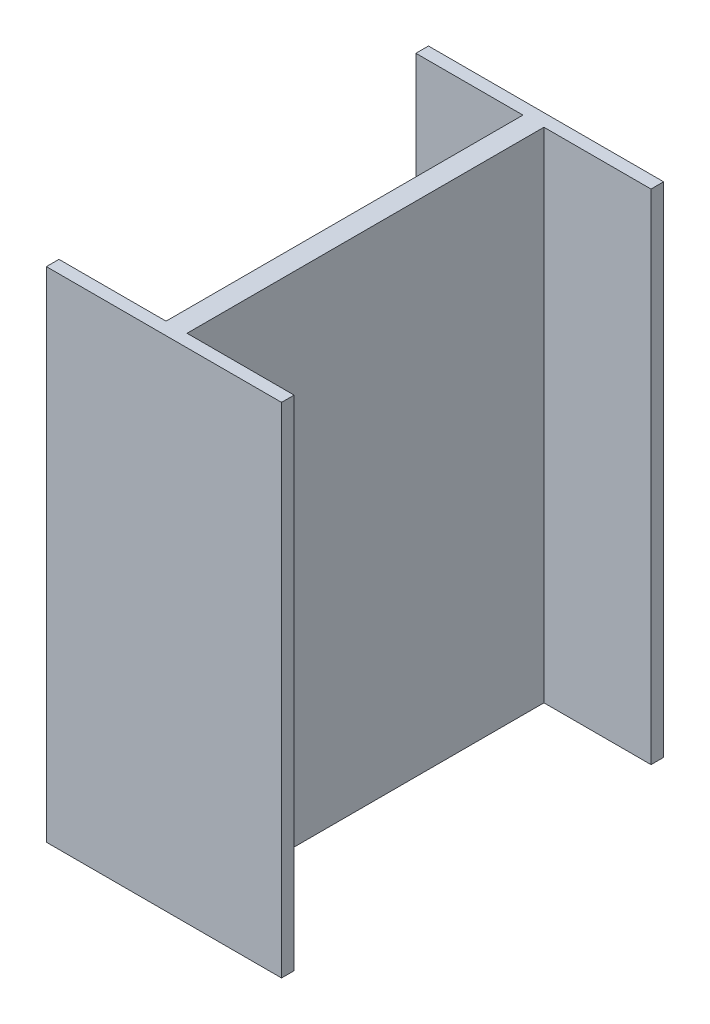
ISO-10303-21;
HEADER;
FILE_DESCRIPTION(('STEP AP214'),'2;1');
FILE_NAME('part.step','',(''),(''),'','','');
FILE_SCHEMA(('AUTOMOTIVE_DESIGN { 1 0 10303 214 1 1 1 1 }'));
ENDSEC;
DATA;
#1=APPLICATION_CONTEXT('core data for automotive mechanical design processes');
#2=APPLICATION_PROTOCOL_DEFINITION('international standard','automotive_design',2000,#1);
#3=PRODUCT_CONTEXT('',#1,'mechanical');
#4=PRODUCT('Part','Part','',(#3));
#5=PRODUCT_RELATED_PRODUCT_CATEGORY('part','',(#4));
#6=PRODUCT_DEFINITION_FORMATION('','',#4);
#7=PRODUCT_DEFINITION_CONTEXT('part definition',#1,'design');
#8=PRODUCT_DEFINITION('design','',#6,#7);
#9=PRODUCT_DEFINITION_SHAPE('','',#8);
#10=(LENGTH_UNIT() NAMED_UNIT(*) SI_UNIT(.MILLI.,.METRE.));
#11=(NAMED_UNIT(*) PLANE_ANGLE_UNIT() SI_UNIT($,.RADIAN.));
#12=(NAMED_UNIT(*) SI_UNIT($,.STERADIAN.) SOLID_ANGLE_UNIT());
#13=UNCERTAINTY_MEASURE_WITH_UNIT(LENGTH_MEASURE(1.E-05),#10,'distance_accuracy_value','');
#14=(GEOMETRIC_REPRESENTATION_CONTEXT(3) GLOBAL_UNCERTAINTY_ASSIGNED_CONTEXT((#13)) GLOBAL_UNIT_ASSIGNED_CONTEXT((#10,
#11,#12)) REPRESENTATION_CONTEXT('',''));
#15=CARTESIAN_POINT('',(0.,0.,0.));
#16=DIRECTION('',(0.,0.,1.));
#17=DIRECTION('',(1.,0.,0.));
#18=AXIS2_PLACEMENT_3D('',#15,#16,#17);
#19=CARTESIAN_POINT('',(-25.0000000000001,1187.25,-425.));
#20=DIRECTION('',(0.,0.,1.));
#21=DIRECTION('',(1.,0.,0.));
#22=AXIS2_PLACEMENT_3D('',#19,#20,#21);
#23=PLANE('',#22);
#24=DIRECTION('',(-1.,0.,0.));
#25=VECTOR('',#24,1.);
#26=CARTESIAN_POINT('',(-25.0000000000001,0.,-425.));
#27=LINE('',#26,#25);
#28=CARTESIAN_POINT('',(-25.0000000000001,0.,-425.));
#29=VERTEX_POINT('',#28);
#30=CARTESIAN_POINT('',(-280.014880556969,0.,-425.));
#31=VERTEX_POINT('',#30);
#32=EDGE_CURVE('E163',#29,#31,#27,.T.);
#33=ORIENTED_EDGE('',*,*,#32,.F.);
#34=DIRECTION('',(0.,-1.,0.));
#35=VECTOR('',#34,1.);
#36=CARTESIAN_POINT('',(-25.0000000000001,1187.25,-425.));
#37=LINE('',#36,#35);
#38=CARTESIAN_POINT('',(-25.0000000000001,1187.25,-425.));
#39=VERTEX_POINT('',#38);
#40=EDGE_CURVE('E11',#39,#29,#37,.T.);
#41=ORIENTED_EDGE('',*,*,#40,.F.);
#42=DIRECTION('',(-1.,0.,0.));
#43=VECTOR('',#42,1.);
#44=CARTESIAN_POINT('',(-25.0000000000001,1187.25,-425.));
#45=LINE('',#44,#43);
#46=CARTESIAN_POINT('',(-280.014880556969,1187.25,-425.));
#47=VERTEX_POINT('',#46);
#48=EDGE_CURVE('E193',#39,#47,#45,.T.);
#49=ORIENTED_EDGE('',*,*,#48,.T.);
#50=DIRECTION('',(0.,-1.,0.));
#51=VECTOR('',#50,1.);
#52=CARTESIAN_POINT('',(-280.014880556969,1187.25,-425.));
#53=LINE('',#52,#51);
#54=EDGE_CURVE('E45',#47,#31,#53,.T.);
#55=ORIENTED_EDGE('',*,*,#54,.T.);
#56=EDGE_LOOP('',(#33,#41,#49,#55));
#57=FACE_BOUND('',#56,.T.);
#58=ADVANCED_FACE('F42',(#57),#23,.T.);
#59=CARTESIAN_POINT('',(-25.0000000000001,1187.25,-425.));
#60=DIRECTION('',(1.,0.,0.));
#61=DIRECTION('',(0.,0.,-1.));
#62=AXIS2_PLACEMENT_3D('',#59,#60,#61);
#63=PLANE('',#62);
#64=DIRECTION('',(0.,0.,1.));
#65=VECTOR('',#64,1.);
#66=CARTESIAN_POINT('',(-25.0000000000001,0.,-425.));
#67=LINE('',#66,#65);
#68=CARTESIAN_POINT('',(-25.0000000000001,0.,425.));
#69=VERTEX_POINT('',#68);
#70=EDGE_CURVE('E99',#29,#69,#67,.T.);
#71=ORIENTED_EDGE('',*,*,#70,.T.);
#72=DIRECTION('',(0.,-1.,0.));
#73=VECTOR('',#72,1.);
#74=CARTESIAN_POINT('',(-25.0000000000001,1187.25,425.));
#75=LINE('',#74,#73);
#76=CARTESIAN_POINT('',(-25.0000000000001,1187.25,425.));
#77=VERTEX_POINT('',#76);
#78=EDGE_CURVE('E51',#77,#69,#75,.T.);
#79=ORIENTED_EDGE('',*,*,#78,.F.);
#80=DIRECTION('',(0.,0.,1.));
#81=VECTOR('',#80,1.);
#82=CARTESIAN_POINT('',(-25.0000000000001,1187.25,-425.));
#83=LINE('',#82,#81);
#84=EDGE_CURVE('E141',#39,#77,#83,.T.);
#85=ORIENTED_EDGE('',*,*,#84,.F.);
#86=ORIENTED_EDGE('',*,*,#40,.T.);
#87=EDGE_LOOP('',(#71,#79,#85,#86));
#88=FACE_BOUND('',#87,.T.);
#89=ADVANCED_FACE('F269',(#88),#63,.F.);
#90=CARTESIAN_POINT('',(-25.0000000000001,1187.25,425.));
#91=DIRECTION('',(0.,0.,1.));
#92=DIRECTION('',(1.,0.,0.));
#93=AXIS2_PLACEMENT_3D('',#90,#91,#92);
#94=PLANE('',#93);
#95=DIRECTION('',(-1.,0.,0.));
#96=VECTOR('',#95,1.);
#97=CARTESIAN_POINT('',(-25.0000000000001,0.,425.));
#98=LINE('',#97,#96);
#99=CARTESIAN_POINT('',(-280.014880556968,0.,425.));
#100=VERTEX_POINT('',#99);
#101=EDGE_CURVE('E148',#69,#100,#98,.T.);
#102=ORIENTED_EDGE('',*,*,#101,.T.);
#103=DIRECTION('',(0.,-1.,0.));
#104=VECTOR('',#103,1.);
#105=CARTESIAN_POINT('',(-280.014880556968,1187.25,425.));
#106=LINE('',#105,#104);
#107=CARTESIAN_POINT('',(-280.014880556968,1187.25,425.));
#108=VERTEX_POINT('',#107);
#109=EDGE_CURVE('E145',#108,#100,#106,.T.);
#110=ORIENTED_EDGE('',*,*,#109,.F.);
#111=DIRECTION('',(-1.,0.,0.));
#112=VECTOR('',#111,1.);
#113=CARTESIAN_POINT('',(-25.0000000000001,1187.25,425.));
#114=LINE('',#113,#112);
#115=EDGE_CURVE('E136',#77,#108,#114,.T.);
#116=ORIENTED_EDGE('',*,*,#115,.F.);
#117=ORIENTED_EDGE('',*,*,#78,.T.);
#118=EDGE_LOOP('',(#102,#110,#116,#117));
#119=FACE_BOUND('',#118,.T.);
#120=ADVANCED_FACE('F146',(#119),#94,.F.);
#121=CARTESIAN_POINT('',(-280.014880556966,1187.25,455.));
#122=DIRECTION('',(-1.,0.,0.));
#123=DIRECTION('',(0.,0.,1.));
#124=AXIS2_PLACEMENT_3D('',#121,#122,#123);
#125=PLANE('',#124);
#126=DIRECTION('',(0.,0.,-1.));
#127=VECTOR('',#126,1.);
#128=CARTESIAN_POINT('',(-280.014880556966,0.,455.));
#129=LINE('',#128,#127);
#130=CARTESIAN_POINT('',(-280.014880556966,0.,455.));
#131=VERTEX_POINT('',#130);
#132=EDGE_CURVE('E190',#131,#100,#129,.T.);
#133=ORIENTED_EDGE('',*,*,#132,.F.);
#134=DIRECTION('',(0.,-1.,0.));
#135=VECTOR('',#134,1.);
#136=CARTESIAN_POINT('',(-280.014880556966,1187.25,455.));
#137=LINE('',#136,#135);
#138=CARTESIAN_POINT('',(-280.014880556966,1187.25,455.));
#139=VERTEX_POINT('',#138);
#140=EDGE_CURVE('E152',#139,#131,#137,.T.);
#141=ORIENTED_EDGE('',*,*,#140,.F.);
#142=DIRECTION('',(0.,0.,-1.));
#143=VECTOR('',#142,1.);
#144=CARTESIAN_POINT('',(-280.014880556966,1187.25,455.));
#145=LINE('',#144,#143);
#146=EDGE_CURVE('E140',#139,#108,#145,.T.);
#147=ORIENTED_EDGE('',*,*,#146,.T.);
#148=ORIENTED_EDGE('',*,*,#109,.T.);
#149=EDGE_LOOP('',(#133,#141,#147,#148));
#150=FACE_BOUND('',#149,.T.);
#151=ADVANCED_FACE('F155',(#150),#125,.T.);
#152=CARTESIAN_POINT('',(-37.5,1187.25,455.));
#153=DIRECTION('',(0.,0.,1.));
#154=DIRECTION('',(1.,0.,0.));
#155=AXIS2_PLACEMENT_3D('',#152,#153,#154);
#156=PLANE('',#155);
#157=DIRECTION('',(-1.,0.,0.));
#158=VECTOR('',#157,1.);
#159=CARTESIAN_POINT('',(-37.5,0.,455.));
#160=LINE('',#159,#158);
#161=CARTESIAN_POINT('',(280.014880556966,0.,455.));
#162=VERTEX_POINT('',#161);
#163=EDGE_CURVE('E187',#162,#131,#160,.T.);
#164=ORIENTED_EDGE('',*,*,#163,.F.);
#165=DIRECTION('',(0.,-1.,0.));
#166=VECTOR('',#165,1.);
#167=CARTESIAN_POINT('',(280.014880556966,1187.25,455.));
#168=LINE('',#167,#166);
#169=CARTESIAN_POINT('',(280.014880556966,1187.25,455.));
#170=VERTEX_POINT('',#169);
#171=EDGE_CURVE('E197',#170,#162,#168,.T.);
#172=ORIENTED_EDGE('',*,*,#171,.F.);
#173=DIRECTION('',(1.,0.,0.));
#174=VECTOR('',#173,1.);
#175=CARTESIAN_POINT('',(37.5,1187.25,455.));
#176=LINE('',#175,#174);
#177=EDGE_CURVE('E156',#139,#170,#176,.T.);
#178=ORIENTED_EDGE('',*,*,#177,.F.);
#179=ORIENTED_EDGE('',*,*,#140,.T.);
#180=EDGE_LOOP('',(#164,#172,#178,#179));
#181=FACE_BOUND('',#180,.T.);
#182=ADVANCED_FACE('F220',(#181),#156,.T.);
#183=CARTESIAN_POINT('',(280.014880556966,1187.25,455.));
#184=DIRECTION('',(-1.,0.,0.));
#185=DIRECTION('',(0.,0.,1.));
#186=AXIS2_PLACEMENT_3D('',#183,#184,#185);
#187=PLANE('',#186);
#188=DIRECTION('',(0.,0.,-1.));
#189=VECTOR('',#188,1.);
#190=CARTESIAN_POINT('',(280.014880556966,0.,455.));
#191=LINE('',#190,#189);
#192=CARTESIAN_POINT('',(280.014880556968,0.,425.));
#193=VERTEX_POINT('',#192);
#194=EDGE_CURVE('E184',#162,#193,#191,.T.);
#195=ORIENTED_EDGE('',*,*,#194,.T.);
#196=DIRECTION('',(0.,-1.,0.));
#197=VECTOR('',#196,1.);
#198=CARTESIAN_POINT('',(280.014880556968,1187.25,425.));
#199=LINE('',#198,#197);
#200=CARTESIAN_POINT('',(280.014880556968,1187.25,425.));
#201=VERTEX_POINT('',#200);
#202=EDGE_CURVE('E200',#201,#193,#199,.T.);
#203=ORIENTED_EDGE('',*,*,#202,.F.);
#204=DIRECTION('',(0.,0.,-1.));
#205=VECTOR('',#204,1.);
#206=CARTESIAN_POINT('',(280.014880556966,1187.25,455.));
#207=LINE('',#206,#205);
#208=EDGE_CURVE('E158',#170,#201,#207,.T.);
#209=ORIENTED_EDGE('',*,*,#208,.F.);
#210=ORIENTED_EDGE('',*,*,#171,.T.);
#211=EDGE_LOOP('',(#195,#203,#209,#210));
#212=FACE_BOUND('',#211,.T.);
#213=ADVANCED_FACE('F223',(#212),#187,.F.);
#214=CARTESIAN_POINT('',(25.0000000000001,1187.25,425.));
#215=DIRECTION('',(0.,0.,-1.));
#216=DIRECTION('',(-1.,0.,0.));
#217=AXIS2_PLACEMENT_3D('',#214,#215,#216);
#218=PLANE('',#217);
#219=DIRECTION('',(1.,0.,0.));
#220=VECTOR('',#219,1.);
#221=CARTESIAN_POINT('',(25.0000000000001,0.,425.));
#222=LINE('',#221,#220);
#223=CARTESIAN_POINT('',(25.0000000000001,0.,425.));
#224=VERTEX_POINT('',#223);
#225=EDGE_CURVE('E181',#224,#193,#222,.T.);
#226=ORIENTED_EDGE('',*,*,#225,.F.);
#227=DIRECTION('',(0.,-1.,0.));
#228=VECTOR('',#227,1.);
#229=CARTESIAN_POINT('',(25.0000000000001,1187.25,425.));
#230=LINE('',#229,#228);
#231=CARTESIAN_POINT('',(25.0000000000001,1187.25,425.));
#232=VERTEX_POINT('',#231);
#233=EDGE_CURVE('E202',#232,#224,#230,.T.);
#234=ORIENTED_EDGE('',*,*,#233,.F.);
#235=DIRECTION('',(1.,0.,0.));
#236=VECTOR('',#235,1.);
#237=CARTESIAN_POINT('',(25.0000000000001,1187.25,425.));
#238=LINE('',#237,#236);
#239=EDGE_CURVE('E227',#232,#201,#238,.T.);
#240=ORIENTED_EDGE('',*,*,#239,.T.);
#241=ORIENTED_EDGE('',*,*,#202,.T.);
#242=EDGE_LOOP('',(#226,#234,#240,#241));
#243=FACE_BOUND('',#242,.T.);
#244=ADVANCED_FACE('F259',(#243),#218,.T.);
#245=CARTESIAN_POINT('',(25.0000000000001,1187.25,-425.));
#246=DIRECTION('',(1.,0.,0.));
#247=DIRECTION('',(0.,0.,-1.));
#248=AXIS2_PLACEMENT_3D('',#245,#246,#247);
#249=PLANE('',#248);
#250=DIRECTION('',(0.,0.,1.));
#251=VECTOR('',#250,1.);
#252=CARTESIAN_POINT('',(25.0000000000001,0.,-425.));
#253=LINE('',#252,#251);
#254=CARTESIAN_POINT('',(25.0000000000001,0.,-425.));
#255=VERTEX_POINT('',#254);
#256=EDGE_CURVE('E178',#255,#224,#253,.T.);
#257=ORIENTED_EDGE('',*,*,#256,.F.);
#258=DIRECTION('',(0.,-1.,0.));
#259=VECTOR('',#258,1.);
#260=CARTESIAN_POINT('',(25.0000000000001,1187.25,-425.));
#261=LINE('',#260,#259);
#262=CARTESIAN_POINT('',(25.0000000000001,1187.25,-425.));
#263=VERTEX_POINT('',#262);
#264=EDGE_CURVE('E204',#263,#255,#261,.T.);
#265=ORIENTED_EDGE('',*,*,#264,.F.);
#266=DIRECTION('',(0.,0.,1.));
#267=VECTOR('',#266,1.);
#268=CARTESIAN_POINT('',(25.0000000000001,1187.25,-425.));
#269=LINE('',#268,#267);
#270=EDGE_CURVE('E228',#263,#232,#269,.T.);
#271=ORIENTED_EDGE('',*,*,#270,.T.);
#272=ORIENTED_EDGE('',*,*,#233,.T.);
#273=EDGE_LOOP('',(#257,#265,#271,#272));
#274=FACE_BOUND('',#273,.T.);
#275=ADVANCED_FACE('F256',(#274),#249,.T.);
#276=CARTESIAN_POINT('',(25.0000000000001,1187.25,-425.));
#277=DIRECTION('',(0.,0.,-1.));
#278=DIRECTION('',(-1.,0.,0.));
#279=AXIS2_PLACEMENT_3D('',#276,#277,#278);
#280=PLANE('',#279);
#281=DIRECTION('',(1.,0.,0.));
#282=VECTOR('',#281,1.);
#283=CARTESIAN_POINT('',(25.0000000000001,0.,-425.));
#284=LINE('',#283,#282);
#285=CARTESIAN_POINT('',(280.014880556969,0.,-425.));
#286=VERTEX_POINT('',#285);
#287=EDGE_CURVE('E175',#255,#286,#284,.T.);
#288=ORIENTED_EDGE('',*,*,#287,.T.);
#289=DIRECTION('',(0.,-1.,0.));
#290=VECTOR('',#289,1.);
#291=CARTESIAN_POINT('',(280.014880556969,1187.25,-425.));
#292=LINE('',#291,#290);
#293=CARTESIAN_POINT('',(280.014880556969,1187.25,-425.));
#294=VERTEX_POINT('',#293);
#295=EDGE_CURVE('E206',#294,#286,#292,.T.);
#296=ORIENTED_EDGE('',*,*,#295,.F.);
#297=DIRECTION('',(1.,0.,0.));
#298=VECTOR('',#297,1.);
#299=CARTESIAN_POINT('',(25.0000000000001,1187.25,-425.));
#300=LINE('',#299,#298);
#301=EDGE_CURVE('E233',#263,#294,#300,.T.);
#302=ORIENTED_EDGE('',*,*,#301,.F.);
#303=ORIENTED_EDGE('',*,*,#264,.T.);
#304=EDGE_LOOP('',(#288,#296,#302,#303));
#305=FACE_BOUND('',#304,.T.);
#306=ADVANCED_FACE('F253',(#305),#280,.F.);
#307=CARTESIAN_POINT('',(280.014880556966,1187.25,-455.));
#308=DIRECTION('',(1.,0.,0.));
#309=DIRECTION('',(0.,0.,-1.));
#310=AXIS2_PLACEMENT_3D('',#307,#308,#309);
#311=PLANE('',#310);
#312=DIRECTION('',(0.,0.,1.));
#313=VECTOR('',#312,1.);
#314=CARTESIAN_POINT('',(280.014880556966,0.,-455.));
#315=LINE('',#314,#313);
#316=CARTESIAN_POINT('',(280.014880556966,0.,-455.));
#317=VERTEX_POINT('',#316);
#318=EDGE_CURVE('E172',#317,#286,#315,.T.);
#319=ORIENTED_EDGE('',*,*,#318,.F.);
#320=DIRECTION('',(0.,-1.,0.));
#321=VECTOR('',#320,1.);
#322=CARTESIAN_POINT('',(280.014880556966,1187.25,-455.));
#323=LINE('',#322,#321);
#324=CARTESIAN_POINT('',(280.014880556966,1187.25,-455.));
#325=VERTEX_POINT('',#324);
#326=EDGE_CURVE('E208',#325,#317,#323,.T.);
#327=ORIENTED_EDGE('',*,*,#326,.F.);
#328=DIRECTION('',(0.,0.,1.));
#329=VECTOR('',#328,1.);
#330=CARTESIAN_POINT('',(280.014880556966,1187.25,-455.));
#331=LINE('',#330,#329);
#332=EDGE_CURVE('E235',#325,#294,#331,.T.);
#333=ORIENTED_EDGE('',*,*,#332,.T.);
#334=ORIENTED_EDGE('',*,*,#295,.T.);
#335=EDGE_LOOP('',(#319,#327,#333,#334));
#336=FACE_BOUND('',#335,.T.);
#337=ADVANCED_FACE('F249',(#336),#311,.T.);
#338=CARTESIAN_POINT('',(37.5,1187.25,-455.));
#339=DIRECTION('',(0.,0.,-1.));
#340=DIRECTION('',(-1.,0.,0.));
#341=AXIS2_PLACEMENT_3D('',#338,#339,#340);
#342=PLANE('',#341);
#343=DIRECTION('',(1.,0.,0.));
#344=VECTOR('',#343,1.);
#345=CARTESIAN_POINT('',(37.5,0.,-455.));
#346=LINE('',#345,#344);
#347=CARTESIAN_POINT('',(-280.014880556966,0.,-455.));
#348=VERTEX_POINT('',#347);
#349=EDGE_CURVE('E169',#348,#317,#346,.T.);
#350=ORIENTED_EDGE('',*,*,#349,.F.);
#351=DIRECTION('',(0.,-1.,0.));
#352=VECTOR('',#351,1.);
#353=CARTESIAN_POINT('',(-280.014880556966,1187.25,-455.));
#354=LINE('',#353,#352);
#355=CARTESIAN_POINT('',(-280.014880556966,1187.25,-455.));
#356=VERTEX_POINT('',#355);
#357=EDGE_CURVE('E209',#356,#348,#354,.T.);
#358=ORIENTED_EDGE('',*,*,#357,.F.);
#359=DIRECTION('',(-1.,0.,0.));
#360=VECTOR('',#359,1.);
#361=CARTESIAN_POINT('',(-37.5,1187.25,-455.));
#362=LINE('',#361,#360);
#363=EDGE_CURVE('E238',#325,#356,#362,.T.);
#364=ORIENTED_EDGE('',*,*,#363,.F.);
#365=ORIENTED_EDGE('',*,*,#326,.T.);
#366=EDGE_LOOP('',(#350,#358,#364,#365));
#367=FACE_BOUND('',#366,.T.);
#368=ADVANCED_FACE('F244',(#367),#342,.T.);
#369=CARTESIAN_POINT('',(-280.014880556966,1187.25,-455.));
#370=DIRECTION('',(1.,0.,0.));
#371=DIRECTION('',(0.,0.,-1.));
#372=AXIS2_PLACEMENT_3D('',#369,#370,#371);
#373=PLANE('',#372);
#374=DIRECTION('',(0.,0.,1.));
#375=VECTOR('',#374,1.);
#376=CARTESIAN_POINT('',(-280.014880556966,0.,-455.));
#377=LINE('',#376,#375);
#378=EDGE_CURVE('E166',#348,#31,#377,.T.);
#379=ORIENTED_EDGE('',*,*,#378,.T.);
#380=ORIENTED_EDGE('',*,*,#54,.F.);
#381=DIRECTION('',(0.,0.,1.));
#382=VECTOR('',#381,1.);
#383=CARTESIAN_POINT('',(-280.014880556966,1187.25,-455.));
#384=LINE('',#383,#382);
#385=EDGE_CURVE('E109',#356,#47,#384,.T.);
#386=ORIENTED_EDGE('',*,*,#385,.F.);
#387=ORIENTED_EDGE('',*,*,#357,.T.);
#388=EDGE_LOOP('',(#379,#380,#386,#387));
#389=FACE_BOUND('',#388,.T.);
#390=ADVANCED_FACE('F214',(#389),#373,.F.);
#391=CARTESIAN_POINT('',(0.,1187.25,0.));
#392=DIRECTION('',(0.,1.,0.));
#393=DIRECTION('',(0.,0.,1.));
#394=AXIS2_PLACEMENT_3D('',#391,#392,#393);
#395=PLANE('',#394);
#396=ORIENTED_EDGE('',*,*,#48,.F.);
#397=ORIENTED_EDGE('',*,*,#84,.T.);
#398=ORIENTED_EDGE('',*,*,#115,.T.);
#399=ORIENTED_EDGE('',*,*,#146,.F.);
#400=ORIENTED_EDGE('',*,*,#177,.T.);
#401=ORIENTED_EDGE('',*,*,#208,.T.);
#402=ORIENTED_EDGE('',*,*,#239,.F.);
#403=ORIENTED_EDGE('',*,*,#270,.F.);
#404=ORIENTED_EDGE('',*,*,#301,.T.);
#405=ORIENTED_EDGE('',*,*,#332,.F.);
#406=ORIENTED_EDGE('',*,*,#363,.T.);
#407=ORIENTED_EDGE('',*,*,#385,.T.);
#408=EDGE_LOOP('',(#396,#397,#398,#399,#400,#401,#402,#403,#404,#405,#406,#407));
#409=FACE_BOUND('',#408,.T.);
#410=ADVANCED_FACE('F138',(#409),#395,.T.);
#411=CARTESIAN_POINT('',(0.,0.,0.));
#412=DIRECTION('',(0.,1.,0.));
#413=DIRECTION('',(0.,0.,1.));
#414=AXIS2_PLACEMENT_3D('',#411,#412,#413);
#415=PLANE('',#414);
#416=ORIENTED_EDGE('',*,*,#32,.T.);
#417=ORIENTED_EDGE('',*,*,#378,.F.);
#418=ORIENTED_EDGE('',*,*,#349,.T.);
#419=ORIENTED_EDGE('',*,*,#318,.T.);
#420=ORIENTED_EDGE('',*,*,#287,.F.);
#421=ORIENTED_EDGE('',*,*,#256,.T.);
#422=ORIENTED_EDGE('',*,*,#225,.T.);
#423=ORIENTED_EDGE('',*,*,#194,.F.);
#424=ORIENTED_EDGE('',*,*,#163,.T.);
#425=ORIENTED_EDGE('',*,*,#132,.T.);
#426=ORIENTED_EDGE('',*,*,#101,.F.);
#427=ORIENTED_EDGE('',*,*,#70,.F.);
#428=EDGE_LOOP('',(#416,#417,#418,#419,#420,#421,#422,#423,#424,#425,#426,#427));
#429=FACE_BOUND('',#428,.T.);
#430=ADVANCED_FACE('F216',(#429),#415,.F.);
#431=CLOSED_SHELL('',(#58,#89,#120,#151,#182,#213,#244,#275,#306,#337,#368,#390,#410,#430));
#432=MANIFOLD_SOLID_BREP('B2',#431);
#433=ADVANCED_BREP_SHAPE_REPRESENTATION('',(#18,#432),#14);
#434=SHAPE_DEFINITION_REPRESENTATION(#9,#433);
ENDSEC;
END-ISO-10303-21;
